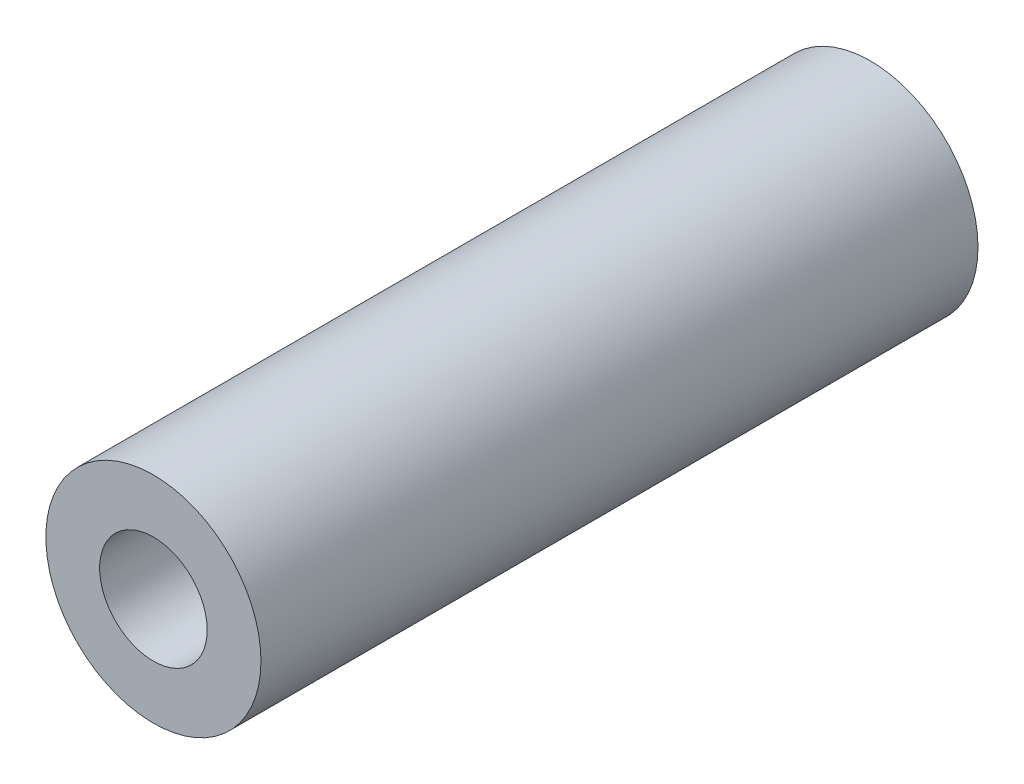
ISO-10303-21;
HEADER;
FILE_DESCRIPTION(('STEP AP214'),'2;1');
FILE_NAME('part.step','',(''),(''),'','','');
FILE_SCHEMA(('AUTOMOTIVE_DESIGN { 1 0 10303 214 1 1 1 1 }'));
ENDSEC;
DATA;
#1=APPLICATION_CONTEXT('core data for automotive mechanical design processes');
#2=APPLICATION_PROTOCOL_DEFINITION('international standard','automotive_design',2000,#1);
#3=PRODUCT_CONTEXT('',#1,'mechanical');
#4=PRODUCT('Part','Part','',(#3));
#5=PRODUCT_RELATED_PRODUCT_CATEGORY('part','',(#4));
#6=PRODUCT_DEFINITION_FORMATION('','',#4);
#7=PRODUCT_DEFINITION_CONTEXT('part definition',#1,'design');
#8=PRODUCT_DEFINITION('design','',#6,#7);
#9=PRODUCT_DEFINITION_SHAPE('','',#8);
#10=(LENGTH_UNIT() NAMED_UNIT(*) SI_UNIT(.MILLI.,.METRE.));
#11=(NAMED_UNIT(*) PLANE_ANGLE_UNIT() SI_UNIT($,.RADIAN.));
#12=(NAMED_UNIT(*) SI_UNIT($,.STERADIAN.) SOLID_ANGLE_UNIT());
#13=UNCERTAINTY_MEASURE_WITH_UNIT(LENGTH_MEASURE(1.E-05),#10,'distance_accuracy_value','');
#14=(GEOMETRIC_REPRESENTATION_CONTEXT(3) GLOBAL_UNCERTAINTY_ASSIGNED_CONTEXT((#13)) GLOBAL_UNIT_ASSIGNED_CONTEXT((#10,
#11,#12)) REPRESENTATION_CONTEXT('',''));
#15=CARTESIAN_POINT('',(0.,0.,0.));
#16=DIRECTION('',(0.,0.,1.));
#17=DIRECTION('',(1.,0.,0.));
#18=AXIS2_PLACEMENT_3D('',#15,#16,#17);
#19=CARTESIAN_POINT('',(0.,0.,20.));
#20=DIRECTION('',(0.,0.,-1.));
#21=DIRECTION('',(-1.,0.,0.));
#22=AXIS2_PLACEMENT_3D('',#19,#20,#21);
#23=CYLINDRICAL_SURFACE('',#22,3.);
#24=CARTESIAN_POINT('',(0.,0.,20.));
#25=DIRECTION('',(0.,0.,1.));
#26=DIRECTION('',(1.,0.,0.));
#27=AXIS2_PLACEMENT_3D('',#24,#25,#26);
#28=CIRCLE('',#27,3.);
#29=CARTESIAN_POINT('',(3.,0.,20.));
#30=VERTEX_POINT('',#29);
#31=EDGE_CURVE('E10',#30,#30,#28,.T.);
#32=ORIENTED_EDGE('',*,*,#31,.F.);
#33=EDGE_LOOP('',(#32));
#34=FACE_BOUND('',#33,.T.);
#35=CARTESIAN_POINT('',(0.,0.,0.));
#36=DIRECTION('',(0.,0.,1.));
#37=DIRECTION('',(1.,0.,0.));
#38=AXIS2_PLACEMENT_3D('',#35,#36,#37);
#39=CIRCLE('',#38,3.);
#40=CARTESIAN_POINT('',(3.,0.,0.));
#41=VERTEX_POINT('',#40);
#42=EDGE_CURVE('E39',#41,#41,#39,.T.);
#43=ORIENTED_EDGE('',*,*,#42,.T.);
#44=EDGE_LOOP('',(#43));
#45=FACE_BOUND('',#44,.T.);
#46=ADVANCED_FACE('F36',(#34,#45),#23,.T.);
#47=CARTESIAN_POINT('',(0.,0.,20.));
#48=DIRECTION('',(0.,0.,1.));
#49=DIRECTION('',(1.,0.,0.));
#50=AXIS2_PLACEMENT_3D('',#47,#48,#49);
#51=PLANE('',#50);
#52=CARTESIAN_POINT('',(0.,0.,20.));
#53=DIRECTION('',(0.,0.,1.));
#54=DIRECTION('',(1.,0.,0.));
#55=AXIS2_PLACEMENT_3D('',#52,#53,#54);
#56=CIRCLE('',#55,1.5);
#57=CARTESIAN_POINT('',(1.5,0.,20.));
#58=VERTEX_POINT('',#57);
#59=EDGE_CURVE('E48',#58,#58,#56,.T.);
#60=ORIENTED_EDGE('',*,*,#59,.F.);
#61=EDGE_LOOP('',(#60));
#62=FACE_BOUND('',#61,.T.);
#63=ORIENTED_EDGE('',*,*,#31,.T.);
#64=EDGE_LOOP('',(#63));
#65=FACE_BOUND('',#64,.T.);
#66=ADVANCED_FACE('F73',(#62,#65),#51,.T.);
#67=CARTESIAN_POINT('',(0.,0.,0.));
#68=DIRECTION('',(0.,0.,1.));
#69=DIRECTION('',(1.,0.,0.));
#70=AXIS2_PLACEMENT_3D('',#67,#68,#69);
#71=PLANE('',#70);
#72=CARTESIAN_POINT('',(0.,0.,0.));
#73=DIRECTION('',(0.,0.,-1.));
#74=DIRECTION('',(-1.,0.,0.));
#75=AXIS2_PLACEMENT_3D('',#72,#73,#74);
#76=CIRCLE('',#75,1.5);
#77=CARTESIAN_POINT('',(-1.5,0.,0.));
#78=VERTEX_POINT('',#77);
#79=EDGE_CURVE('E54',#78,#78,#76,.T.);
#80=ORIENTED_EDGE('',*,*,#79,.F.);
#81=EDGE_LOOP('',(#80));
#82=FACE_BOUND('',#81,.T.);
#83=ORIENTED_EDGE('',*,*,#42,.F.);
#84=EDGE_LOOP('',(#83));
#85=FACE_BOUND('',#84,.T.);
#86=ADVANCED_FACE('F69',(#82,#85),#71,.F.);
#87=CARTESIAN_POINT('',(0.,0.,17.));
#88=DIRECTION('',(0.,0.,1.));
#89=DIRECTION('',(1.,0.,0.));
#90=AXIS2_PLACEMENT_3D('',#87,#88,#89);
#91=CYLINDRICAL_SURFACE('',#90,1.5);
#92=CARTESIAN_POINT('',(0.,0.,17.));
#93=DIRECTION('',(0.,0.,1.));
#94=DIRECTION('',(1.,0.,0.));
#95=AXIS2_PLACEMENT_3D('',#92,#93,#94);
#96=CIRCLE('',#95,1.5);
#97=CARTESIAN_POINT('',(1.5,0.,17.));
#98=VERTEX_POINT('',#97);
#99=EDGE_CURVE('E46',#98,#98,#96,.T.);
#100=ORIENTED_EDGE('',*,*,#99,.F.);
#101=EDGE_LOOP('',(#100));
#102=FACE_BOUND('',#101,.T.);
#103=ORIENTED_EDGE('',*,*,#59,.T.);
#104=EDGE_LOOP('',(#103));
#105=FACE_BOUND('',#104,.T.);
#106=ADVANCED_FACE('F72',(#102,#105),#91,.F.);
#107=CARTESIAN_POINT('',(0.,0.,17.));
#108=DIRECTION('',(0.,0.,1.));
#109=DIRECTION('',(1.,0.,0.));
#110=AXIS2_PLACEMENT_3D('',#107,#108,#109);
#111=PLANE('',#110);
#112=ORIENTED_EDGE('',*,*,#99,.T.);
#113=EDGE_LOOP('',(#112));
#114=FACE_BOUND('',#113,.T.);
#115=ADVANCED_FACE('F65',(#114),#111,.T.);
#116=CARTESIAN_POINT('',(0.,0.,3.));
#117=DIRECTION('',(0.,0.,-1.));
#118=DIRECTION('',(-1.,0.,0.));
#119=AXIS2_PLACEMENT_3D('',#116,#117,#118);
#120=CYLINDRICAL_SURFACE('',#119,1.5);
#121=CARTESIAN_POINT('',(0.,0.,3.));
#122=DIRECTION('',(0.,0.,-1.));
#123=DIRECTION('',(-1.,0.,0.));
#124=AXIS2_PLACEMENT_3D('',#121,#122,#123);
#125=CIRCLE('',#124,1.5);
#126=CARTESIAN_POINT('',(-1.5,0.,3.));
#127=VERTEX_POINT('',#126);
#128=EDGE_CURVE('E51',#127,#127,#125,.T.);
#129=ORIENTED_EDGE('',*,*,#128,.F.);
#130=EDGE_LOOP('',(#129));
#131=FACE_BOUND('',#130,.T.);
#132=ORIENTED_EDGE('',*,*,#79,.T.);
#133=EDGE_LOOP('',(#132));
#134=FACE_BOUND('',#133,.T.);
#135=ADVANCED_FACE('F62',(#131,#134),#120,.F.);
#136=CARTESIAN_POINT('',(0.,0.,3.));
#137=DIRECTION('',(0.,0.,-1.));
#138=DIRECTION('',(-1.,0.,0.));
#139=AXIS2_PLACEMENT_3D('',#136,#137,#138);
#140=PLANE('',#139);
#141=ORIENTED_EDGE('',*,*,#128,.T.);
#142=EDGE_LOOP('',(#141));
#143=FACE_BOUND('',#142,.T.);
#144=ADVANCED_FACE('F60',(#143),#140,.T.);
#145=CLOSED_SHELL('',(#46,#66,#86,#106,#115,#135,#144));
#146=MANIFOLD_SOLID_BREP('B2',#145);
#147=ADVANCED_BREP_SHAPE_REPRESENTATION('',(#18,#146),#14);
#148=SHAPE_DEFINITION_REPRESENTATION(#9,#147);
ENDSEC;
END-ISO-10303-21;
